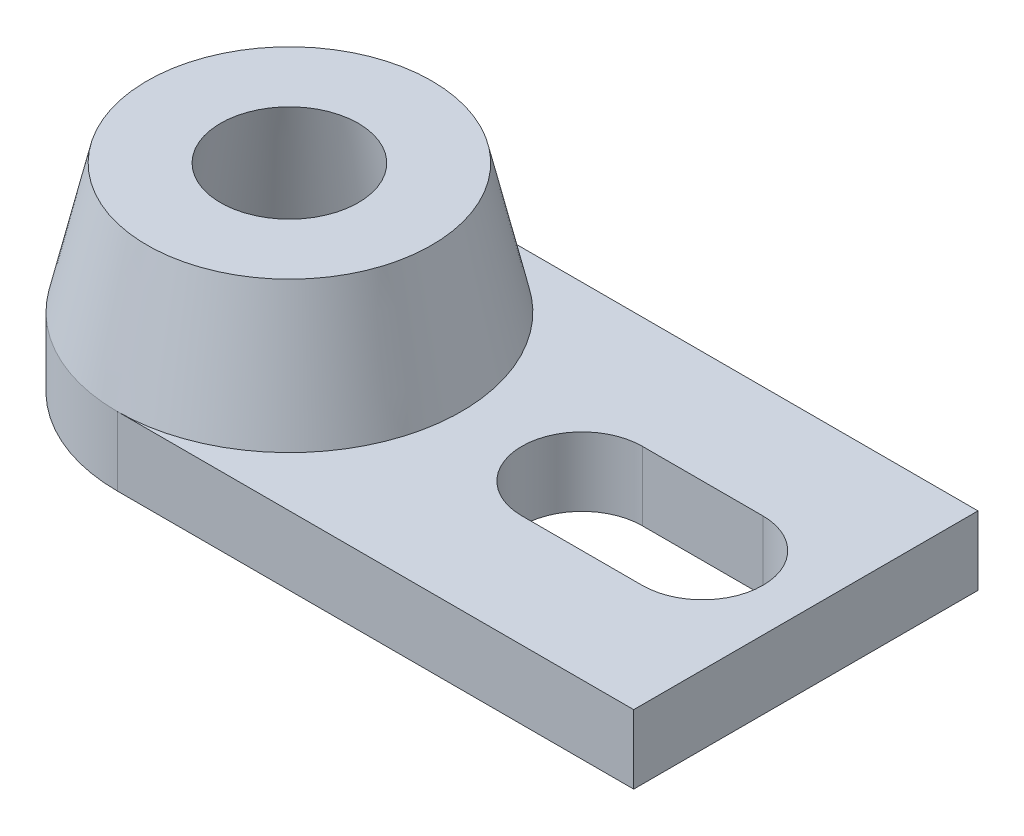
ISO-10303-21;
HEADER;
FILE_DESCRIPTION(('STEP AP214'),'2;1');
FILE_NAME('part.step','',(''),(''),'','','');
FILE_SCHEMA(('AUTOMOTIVE_DESIGN { 1 0 10303 214 1 1 1 1 }'));
ENDSEC;
DATA;
#1=APPLICATION_CONTEXT('core data for automotive mechanical design processes');
#2=APPLICATION_PROTOCOL_DEFINITION('international standard','automotive_design',2000,#1);
#3=PRODUCT_CONTEXT('',#1,'mechanical');
#4=PRODUCT('Part','Part','',(#3));
#5=PRODUCT_RELATED_PRODUCT_CATEGORY('part','',(#4));
#6=PRODUCT_DEFINITION_FORMATION('','',#4);
#7=PRODUCT_DEFINITION_CONTEXT('part definition',#1,'design');
#8=PRODUCT_DEFINITION('design','',#6,#7);
#9=PRODUCT_DEFINITION_SHAPE('','',#8);
#10=(LENGTH_UNIT() NAMED_UNIT(*) SI_UNIT(.MILLI.,.METRE.));
#11=(NAMED_UNIT(*) PLANE_ANGLE_UNIT() SI_UNIT($,.RADIAN.));
#12=(NAMED_UNIT(*) SI_UNIT($,.STERADIAN.) SOLID_ANGLE_UNIT());
#13=UNCERTAINTY_MEASURE_WITH_UNIT(LENGTH_MEASURE(1.E-05),#10,'distance_accuracy_value','');
#14=(GEOMETRIC_REPRESENTATION_CONTEXT(3) GLOBAL_UNCERTAINTY_ASSIGNED_CONTEXT((#13)) GLOBAL_UNIT_ASSIGNED_CONTEXT((#10,
#11,#12)) REPRESENTATION_CONTEXT('',''));
#15=CARTESIAN_POINT('',(0.,0.,0.));
#16=DIRECTION('',(0.,0.,1.));
#17=DIRECTION('',(1.,0.,0.));
#18=AXIS2_PLACEMENT_3D('',#15,#16,#17);
#19=CARTESIAN_POINT('',(0.,0.,0.));
#20=DIRECTION('',(0.,-1.,0.));
#21=DIRECTION('',(0.,0.,-1.));
#22=AXIS2_PLACEMENT_3D('',#19,#20,#21);
#23=CYLINDRICAL_SURFACE('',#22,20.);
#24=CARTESIAN_POINT('',(0.,0.,0.));
#25=DIRECTION('',(0.,-1.,0.));
#26=DIRECTION('',(0.,0.,-1.));
#27=AXIS2_PLACEMENT_3D('',#24,#25,#26);
#28=CIRCLE('',#27,20.);
#29=CARTESIAN_POINT('',(0.,0.,20.));
#30=VERTEX_POINT('',#29);
#31=CARTESIAN_POINT('',(0.,0.,-20.));
#32=VERTEX_POINT('',#31);
#33=EDGE_CURVE('E48',#30,#32,#28,.T.);
#34=ORIENTED_EDGE('',*,*,#33,.F.);
#35=DIRECTION('',(0.,-1.,0.));
#36=VECTOR('',#35,1.);
#37=CARTESIAN_POINT('',(0.,8.,20.));
#38=LINE('',#37,#36);
#39=CARTESIAN_POINT('',(0.,8.,20.));
#40=VERTEX_POINT('',#39);
#41=EDGE_CURVE('E182',#40,#30,#38,.T.);
#42=ORIENTED_EDGE('',*,*,#41,.F.);
#43=CARTESIAN_POINT('',(0.,8.,0.));
#44=DIRECTION('',(0.,-1.,0.));
#45=DIRECTION('',(0.,0.,-1.));
#46=AXIS2_PLACEMENT_3D('',#43,#44,#45);
#47=CIRCLE('',#46,20.);
#48=CARTESIAN_POINT('',(0.,8.,-20.));
#49=VERTEX_POINT('',#48);
#50=EDGE_CURVE('E201',#40,#49,#47,.T.);
#51=ORIENTED_EDGE('',*,*,#50,.T.);
#52=DIRECTION('',(0.,-1.,0.));
#53=VECTOR('',#52,1.);
#54=CARTESIAN_POINT('',(0.,8.,-20.));
#55=LINE('',#54,#53);
#56=EDGE_CURVE('E59',#49,#32,#55,.T.);
#57=ORIENTED_EDGE('',*,*,#56,.T.);
#58=EDGE_LOOP('',(#34,#42,#51,#57));
#59=FACE_BOUND('',#58,.T.);
#60=ADVANCED_FACE('F39',(#59),#23,.T.);
#61=CARTESIAN_POINT('',(0.,23.,0.));
#62=DIRECTION('',(0.,-1.,0.));
#63=DIRECTION('',(0.,0.,-1.));
#64=AXIS2_PLACEMENT_3D('',#61,#62,#63);
#65=CONICAL_SURFACE('',#64,8.,0.174532925199426);
#66=CARTESIAN_POINT('',(0.,0.,0.));
#67=DIRECTION('',(0.,-1.,0.));
#68=DIRECTION('',(0.,0.,-1.));
#69=AXIS2_PLACEMENT_3D('',#66,#67,#68);
#70=CIRCLE('',#69,12.0555205562945);
#71=CARTESIAN_POINT('',(0.,0.,-12.0555205562945));
#72=VERTEX_POINT('',#71);
#73=EDGE_CURVE('E11',#72,#72,#70,.T.);
#74=ORIENTED_EDGE('',*,*,#73,.T.);
#75=EDGE_LOOP('',(#74));
#76=FACE_BOUND('',#75,.T.);
#77=CARTESIAN_POINT('',(0.,23.,0.));
#78=DIRECTION('',(0.,-1.,0.));
#79=DIRECTION('',(0.,0.,-1.));
#80=AXIS2_PLACEMENT_3D('',#77,#78,#79);
#81=CIRCLE('',#80,8.);
#82=CARTESIAN_POINT('',(0.,23.,-8.));
#83=VERTEX_POINT('',#82);
#84=EDGE_CURVE('E185',#83,#83,#81,.T.);
#85=ORIENTED_EDGE('',*,*,#84,.F.);
#86=EDGE_LOOP('',(#85));
#87=FACE_BOUND('',#86,.T.);
#88=ADVANCED_FACE('F41',(#76,#87),#65,.F.);
#89=CARTESIAN_POINT('',(12.0555205562945,0.,0.));
#90=DIRECTION('',(0.,-1.,0.));
#91=DIRECTION('',(0.,0.,-1.));
#92=AXIS2_PLACEMENT_3D('',#89,#90,#91);
#93=PLANE('',#92);
#94=ORIENTED_EDGE('',*,*,#33,.T.);
#95=DIRECTION('',(1.,0.,0.));
#96=VECTOR('',#95,1.);
#97=CARTESIAN_POINT('',(0.,0.,-20.));
#98=LINE('',#97,#96);
#99=CARTESIAN_POINT('',(60.,0.,-20.));
#100=VERTEX_POINT('',#99);
#101=EDGE_CURVE('E153',#32,#100,#98,.T.);
#102=ORIENTED_EDGE('',*,*,#101,.T.);
#103=DIRECTION('',(0.,0.,1.));
#104=VECTOR('',#103,1.);
#105=CARTESIAN_POINT('',(60.,0.,-20.));
#106=LINE('',#105,#104);
#107=CARTESIAN_POINT('',(60.,0.,20.));
#108=VERTEX_POINT('',#107);
#109=EDGE_CURVE('E175',#100,#108,#106,.T.);
#110=ORIENTED_EDGE('',*,*,#109,.T.);
#111=DIRECTION('',(-1.,0.,0.));
#112=VECTOR('',#111,1.);
#113=CARTESIAN_POINT('',(60.,0.,20.));
#114=LINE('',#113,#112);
#115=EDGE_CURVE('E164',#108,#30,#114,.T.);
#116=ORIENTED_EDGE('',*,*,#115,.T.);
#117=EDGE_LOOP('',(#94,#102,#110,#116));
#118=FACE_BOUND('',#117,.T.);
#119=ORIENTED_EDGE('',*,*,#73,.F.);
#120=EDGE_LOOP('',(#119));
#121=FACE_BOUND('',#120,.T.);
#122=CARTESIAN_POINT('',(34.,0.,0.));
#123=DIRECTION('',(0.,-1.,0.));
#124=DIRECTION('',(0.,0.,-1.));
#125=AXIS2_PLACEMENT_3D('',#122,#123,#124);
#126=CIRCLE('',#125,7.);
#127=CARTESIAN_POINT('',(34.,0.,7.));
#128=VERTEX_POINT('',#127);
#129=CARTESIAN_POINT('',(34.,0.,-7.));
#130=VERTEX_POINT('',#129);
#131=EDGE_CURVE('E110',#128,#130,#126,.T.);
#132=ORIENTED_EDGE('',*,*,#131,.F.);
#133=DIRECTION('',(-1.,0.,0.));
#134=VECTOR('',#133,1.);
#135=CARTESIAN_POINT('',(34.,0.,7.));
#136=LINE('',#135,#134);
#137=CARTESIAN_POINT('',(48.,0.,7.));
#138=VERTEX_POINT('',#137);
#139=EDGE_CURVE('E131',#138,#128,#136,.T.);
#140=ORIENTED_EDGE('',*,*,#139,.F.);
#141=CARTESIAN_POINT('',(48.,0.,0.));
#142=DIRECTION('',(0.,-1.,0.));
#143=DIRECTION('',(0.,0.,-1.));
#144=AXIS2_PLACEMENT_3D('',#141,#142,#143);
#145=CIRCLE('',#144,7.);
#146=CARTESIAN_POINT('',(48.,0.,-7.));
#147=VERTEX_POINT('',#146);
#148=EDGE_CURVE('E135',#147,#138,#145,.T.);
#149=ORIENTED_EDGE('',*,*,#148,.F.);
#150=DIRECTION('',(1.,0.,0.));
#151=VECTOR('',#150,1.);
#152=CARTESIAN_POINT('',(34.,0.,-7.));
#153=LINE('',#152,#151);
#154=EDGE_CURVE('E144',#130,#147,#153,.T.);
#155=ORIENTED_EDGE('',*,*,#154,.F.);
#156=EDGE_LOOP('',(#132,#140,#149,#155));
#157=FACE_BOUND('',#156,.T.);
#158=ADVANCED_FACE('F208',(#118,#121,#157),#93,.T.);
#159=CARTESIAN_POINT('',(0.,8.,0.));
#160=DIRECTION('',(0.,-1.,0.));
#161=DIRECTION('',(0.,0.,-1.));
#162=AXIS2_PLACEMENT_3D('',#159,#160,#161);
#163=CONICAL_SURFACE('',#162,20.,0.226892802759263);
#164=CARTESIAN_POINT('',(0.,23.,0.));
#165=DIRECTION('',(0.,-1.,0.));
#166=DIRECTION('',(0.,0.,-1.));
#167=AXIS2_PLACEMENT_3D('',#164,#165,#166);
#168=CIRCLE('',#167,16.5369771331165);
#169=CARTESIAN_POINT('',(0.,23.,-16.5369771331165));
#170=VERTEX_POINT('',#169);
#171=EDGE_CURVE('E197',#170,#170,#168,.T.);
#172=ORIENTED_EDGE('',*,*,#171,.T.);
#173=EDGE_LOOP('',(#172));
#174=FACE_BOUND('',#173,.T.);
#175=EDGE_CURVE('E202',#49,#40,#47,.T.);
#176=ORIENTED_EDGE('',*,*,#175,.F.);
#177=ORIENTED_EDGE('',*,*,#50,.F.);
#178=EDGE_LOOP('',(#176,#177));
#179=FACE_BOUND('',#178,.T.);
#180=ADVANCED_FACE('F223',(#174,#179),#163,.T.);
#181=CARTESIAN_POINT('',(16.5369771331165,23.,0.));
#182=DIRECTION('',(0.,1.,0.));
#183=DIRECTION('',(0.,0.,1.));
#184=AXIS2_PLACEMENT_3D('',#181,#182,#183);
#185=PLANE('',#184);
#186=ORIENTED_EDGE('',*,*,#84,.T.);
#187=EDGE_LOOP('',(#186));
#188=FACE_BOUND('',#187,.T.);
#189=ORIENTED_EDGE('',*,*,#171,.F.);
#190=EDGE_LOOP('',(#189));
#191=FACE_BOUND('',#190,.T.);
#192=ADVANCED_FACE('F226',(#188,#191),#185,.T.);
#193=CARTESIAN_POINT('',(60.,8.,20.));
#194=DIRECTION('',(0.,0.,1.));
#195=DIRECTION('',(1.,0.,0.));
#196=AXIS2_PLACEMENT_3D('',#193,#194,#195);
#197=PLANE('',#196);
#198=ORIENTED_EDGE('',*,*,#115,.F.);
#199=DIRECTION('',(0.,-1.,0.));
#200=VECTOR('',#199,1.);
#201=CARTESIAN_POINT('',(60.,8.,20.));
#202=LINE('',#201,#200);
#203=CARTESIAN_POINT('',(60.,8.,20.));
#204=VERTEX_POINT('',#203);
#205=EDGE_CURVE('E186',#204,#108,#202,.T.);
#206=ORIENTED_EDGE('',*,*,#205,.F.);
#207=DIRECTION('',(-1.,0.,0.));
#208=VECTOR('',#207,1.);
#209=CARTESIAN_POINT('',(60.,8.,20.));
#210=LINE('',#209,#208);
#211=EDGE_CURVE('E168',#204,#40,#210,.T.);
#212=ORIENTED_EDGE('',*,*,#211,.T.);
#213=ORIENTED_EDGE('',*,*,#41,.T.);
#214=EDGE_LOOP('',(#198,#206,#212,#213));
#215=FACE_BOUND('',#214,.T.);
#216=ADVANCED_FACE('F219',(#215),#197,.T.);
#217=CARTESIAN_POINT('',(60.,8.,-20.));
#218=DIRECTION('',(1.,0.,0.));
#219=DIRECTION('',(0.,0.,-1.));
#220=AXIS2_PLACEMENT_3D('',#217,#218,#219);
#221=PLANE('',#220);
#222=ORIENTED_EDGE('',*,*,#109,.F.);
#223=DIRECTION('',(0.,-1.,0.));
#224=VECTOR('',#223,1.);
#225=CARTESIAN_POINT('',(60.,8.,-20.));
#226=LINE('',#225,#224);
#227=CARTESIAN_POINT('',(60.,8.,-20.));
#228=VERTEX_POINT('',#227);
#229=EDGE_CURVE('E189',#228,#100,#226,.T.);
#230=ORIENTED_EDGE('',*,*,#229,.F.);
#231=DIRECTION('',(0.,0.,1.));
#232=VECTOR('',#231,1.);
#233=CARTESIAN_POINT('',(60.,8.,-20.));
#234=LINE('',#233,#232);
#235=EDGE_CURVE('E163',#228,#204,#234,.T.);
#236=ORIENTED_EDGE('',*,*,#235,.T.);
#237=ORIENTED_EDGE('',*,*,#205,.T.);
#238=EDGE_LOOP('',(#222,#230,#236,#237));
#239=FACE_BOUND('',#238,.T.);
#240=ADVANCED_FACE('F217',(#239),#221,.T.);
#241=CARTESIAN_POINT('',(0.,8.,-20.));
#242=DIRECTION('',(0.,0.,-1.));
#243=DIRECTION('',(-1.,0.,0.));
#244=AXIS2_PLACEMENT_3D('',#241,#242,#243);
#245=PLANE('',#244);
#246=ORIENTED_EDGE('',*,*,#101,.F.);
#247=ORIENTED_EDGE('',*,*,#56,.F.);
#248=DIRECTION('',(1.,0.,0.));
#249=VECTOR('',#248,1.);
#250=CARTESIAN_POINT('',(0.,8.,-20.));
#251=LINE('',#250,#249);
#252=EDGE_CURVE('E159',#49,#228,#251,.T.);
#253=ORIENTED_EDGE('',*,*,#252,.T.);
#254=ORIENTED_EDGE('',*,*,#229,.T.);
#255=EDGE_LOOP('',(#246,#247,#253,#254));
#256=FACE_BOUND('',#255,.T.);
#257=ADVANCED_FACE('F212',(#256),#245,.T.);
#258=CARTESIAN_POINT('',(0.,8.,0.));
#259=DIRECTION('',(0.,-1.,0.));
#260=DIRECTION('',(0.,0.,-1.));
#261=AXIS2_PLACEMENT_3D('',#258,#259,#260);
#262=PLANE('',#261);
#263=DIRECTION('',(-1.,0.,0.));
#264=VECTOR('',#263,1.);
#265=CARTESIAN_POINT('',(34.,8.,7.));
#266=LINE('',#265,#264);
#267=CARTESIAN_POINT('',(48.,8.,7.));
#268=VERTEX_POINT('',#267);
#269=CARTESIAN_POINT('',(34.,8.,7.));
#270=VERTEX_POINT('',#269);
#271=EDGE_CURVE('E116',#268,#270,#266,.T.);
#272=ORIENTED_EDGE('',*,*,#271,.T.);
#273=CARTESIAN_POINT('',(34.,8.,0.));
#274=DIRECTION('',(0.,-1.,0.));
#275=DIRECTION('',(0.,0.,-1.));
#276=AXIS2_PLACEMENT_3D('',#273,#274,#275);
#277=CIRCLE('',#276,7.);
#278=CARTESIAN_POINT('',(34.,8.,-7.));
#279=VERTEX_POINT('',#278);
#280=EDGE_CURVE('E107',#270,#279,#277,.T.);
#281=ORIENTED_EDGE('',*,*,#280,.T.);
#282=DIRECTION('',(1.,0.,0.));
#283=VECTOR('',#282,1.);
#284=CARTESIAN_POINT('',(34.,8.,-7.));
#285=LINE('',#284,#283);
#286=CARTESIAN_POINT('',(48.,8.,-7.));
#287=VERTEX_POINT('',#286);
#288=EDGE_CURVE('E120',#279,#287,#285,.T.);
#289=ORIENTED_EDGE('',*,*,#288,.T.);
#290=CARTESIAN_POINT('',(48.,8.,0.));
#291=DIRECTION('',(0.,-1.,0.));
#292=DIRECTION('',(0.,0.,-1.));
#293=AXIS2_PLACEMENT_3D('',#290,#291,#292);
#294=CIRCLE('',#293,7.);
#295=EDGE_CURVE('E125',#287,#268,#294,.T.);
#296=ORIENTED_EDGE('',*,*,#295,.T.);
#297=EDGE_LOOP('',(#272,#281,#289,#296));
#298=FACE_BOUND('',#297,.T.);
#299=ORIENTED_EDGE('',*,*,#175,.T.);
#300=ORIENTED_EDGE('',*,*,#211,.F.);
#301=ORIENTED_EDGE('',*,*,#235,.F.);
#302=ORIENTED_EDGE('',*,*,#252,.F.);
#303=EDGE_LOOP('',(#299,#300,#301,#302));
#304=FACE_BOUND('',#303,.T.);
#305=ADVANCED_FACE('F127',(#298,#304),#262,.F.);
#306=CARTESIAN_POINT('',(34.,8.,0.));
#307=DIRECTION('',(0.,-1.,0.));
#308=DIRECTION('',(0.,0.,-1.));
#309=AXIS2_PLACEMENT_3D('',#306,#307,#308);
#310=CYLINDRICAL_SURFACE('',#309,7.);
#311=ORIENTED_EDGE('',*,*,#131,.T.);
#312=DIRECTION('',(0.,-1.,0.));
#313=VECTOR('',#312,1.);
#314=CARTESIAN_POINT('',(34.,8.,-7.));
#315=LINE('',#314,#313);
#316=EDGE_CURVE('E103',#279,#130,#315,.T.);
#317=ORIENTED_EDGE('',*,*,#316,.F.);
#318=ORIENTED_EDGE('',*,*,#280,.F.);
#319=DIRECTION('',(0.,-1.,0.));
#320=VECTOR('',#319,1.);
#321=CARTESIAN_POINT('',(34.,8.,7.));
#322=LINE('',#321,#320);
#323=EDGE_CURVE('E150',#270,#128,#322,.T.);
#324=ORIENTED_EDGE('',*,*,#323,.T.);
#325=EDGE_LOOP('',(#311,#317,#318,#324));
#326=FACE_BOUND('',#325,.T.);
#327=ADVANCED_FACE('F105',(#326),#310,.F.);
#328=CARTESIAN_POINT('',(34.,8.,7.));
#329=DIRECTION('',(0.,0.,1.));
#330=DIRECTION('',(1.,0.,0.));
#331=AXIS2_PLACEMENT_3D('',#328,#329,#330);
#332=PLANE('',#331);
#333=ORIENTED_EDGE('',*,*,#139,.T.);
#334=ORIENTED_EDGE('',*,*,#323,.F.);
#335=ORIENTED_EDGE('',*,*,#271,.F.);
#336=DIRECTION('',(0.,-1.,0.));
#337=VECTOR('',#336,1.);
#338=CARTESIAN_POINT('',(48.,8.,7.));
#339=LINE('',#338,#337);
#340=EDGE_CURVE('E154',#268,#138,#339,.T.);
#341=ORIENTED_EDGE('',*,*,#340,.T.);
#342=EDGE_LOOP('',(#333,#334,#335,#341));
#343=FACE_BOUND('',#342,.T.);
#344=ADVANCED_FACE('F254',(#343),#332,.F.);
#345=CARTESIAN_POINT('',(48.,8.,0.));
#346=DIRECTION('',(0.,-1.,0.));
#347=DIRECTION('',(0.,0.,-1.));
#348=AXIS2_PLACEMENT_3D('',#345,#346,#347);
#349=CYLINDRICAL_SURFACE('',#348,7.);
#350=ORIENTED_EDGE('',*,*,#148,.T.);
#351=ORIENTED_EDGE('',*,*,#340,.F.);
#352=ORIENTED_EDGE('',*,*,#295,.F.);
#353=DIRECTION('',(0.,-1.,0.));
#354=VECTOR('',#353,1.);
#355=CARTESIAN_POINT('',(48.,8.,-7.));
#356=LINE('',#355,#354);
#357=EDGE_CURVE('E115',#287,#147,#356,.T.);
#358=ORIENTED_EDGE('',*,*,#357,.T.);
#359=EDGE_LOOP('',(#350,#351,#352,#358));
#360=FACE_BOUND('',#359,.T.);
#361=ADVANCED_FACE('F252',(#360),#349,.F.);
#362=CARTESIAN_POINT('',(34.,8.,-7.));
#363=DIRECTION('',(0.,0.,-1.));
#364=DIRECTION('',(-1.,0.,0.));
#365=AXIS2_PLACEMENT_3D('',#362,#363,#364);
#366=PLANE('',#365);
#367=ORIENTED_EDGE('',*,*,#154,.T.);
#368=ORIENTED_EDGE('',*,*,#357,.F.);
#369=ORIENTED_EDGE('',*,*,#288,.F.);
#370=ORIENTED_EDGE('',*,*,#316,.T.);
#371=EDGE_LOOP('',(#367,#368,#369,#370));
#372=FACE_BOUND('',#371,.T.);
#373=ADVANCED_FACE('F121',(#372),#366,.F.);
#374=CLOSED_SHELL('',(#60,#88,#158,#180,#192,#216,#240,#257,#305,#327,#344,#361,#373));
#375=MANIFOLD_SOLID_BREP('B2',#374);
#376=ADVANCED_BREP_SHAPE_REPRESENTATION('',(#18,#375),#14);
#377=SHAPE_DEFINITION_REPRESENTATION(#9,#376);
ENDSEC;
END-ISO-10303-21;
